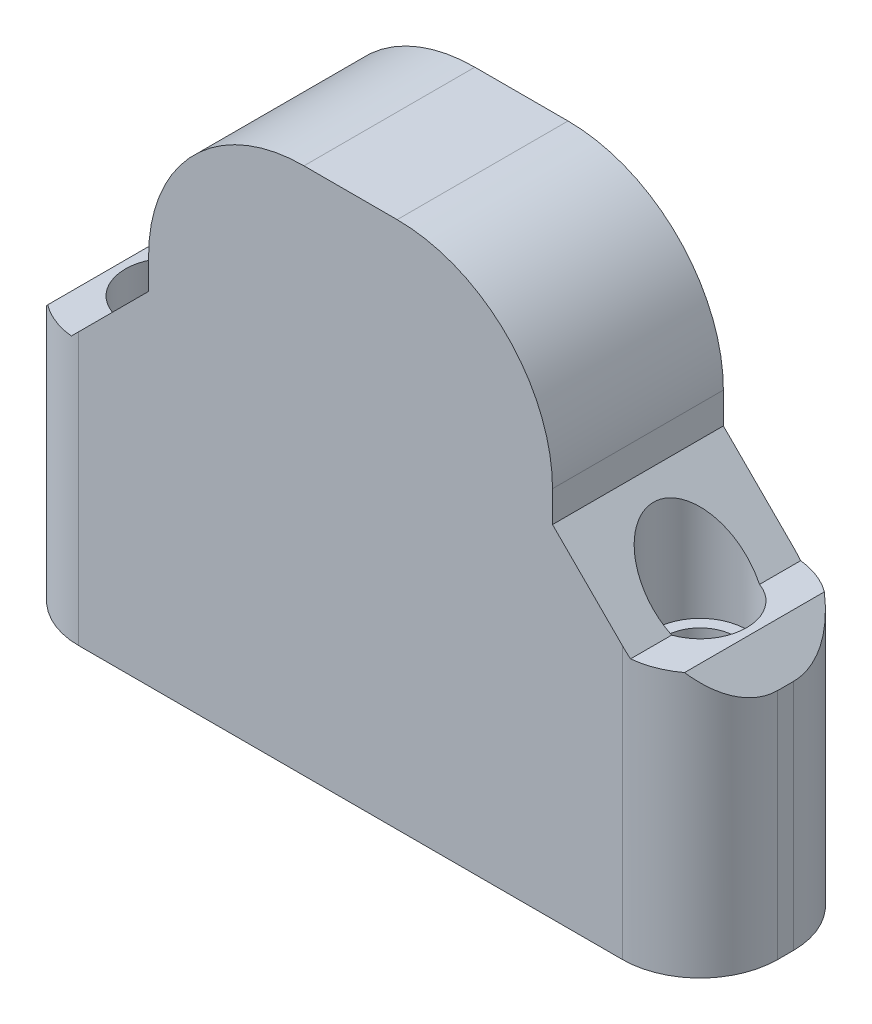
ISO-10303-21;
HEADER;
FILE_DESCRIPTION(('STEP AP214'),'2;1');
FILE_NAME('part.step','',(''),(''),'','','');
FILE_SCHEMA(('AUTOMOTIVE_DESIGN { 1 0 10303 214 1 1 1 1 }'));
ENDSEC;
DATA;
#1=APPLICATION_CONTEXT('core data for automotive mechanical design processes');
#2=APPLICATION_PROTOCOL_DEFINITION('international standard','automotive_design',2000,#1);
#3=PRODUCT_CONTEXT('',#1,'mechanical');
#4=PRODUCT('Part','Part','',(#3));
#5=PRODUCT_RELATED_PRODUCT_CATEGORY('part','',(#4));
#6=PRODUCT_DEFINITION_FORMATION('','',#4);
#7=PRODUCT_DEFINITION_CONTEXT('part definition',#1,'design');
#8=PRODUCT_DEFINITION('design','',#6,#7);
#9=PRODUCT_DEFINITION_SHAPE('','',#8);
#10=(LENGTH_UNIT() NAMED_UNIT(*) SI_UNIT(.MILLI.,.METRE.));
#11=(NAMED_UNIT(*) PLANE_ANGLE_UNIT() SI_UNIT($,.RADIAN.));
#12=(NAMED_UNIT(*) SI_UNIT($,.STERADIAN.) SOLID_ANGLE_UNIT());
#13=UNCERTAINTY_MEASURE_WITH_UNIT(LENGTH_MEASURE(1.E-05),#10,'distance_accuracy_value','');
#14=(GEOMETRIC_REPRESENTATION_CONTEXT(3) GLOBAL_UNCERTAINTY_ASSIGNED_CONTEXT((#13)) GLOBAL_UNIT_ASSIGNED_CONTEXT((#10,
#11,#12)) REPRESENTATION_CONTEXT('',''));
#15=CARTESIAN_POINT('',(0.,0.,0.));
#16=DIRECTION('',(0.,0.,1.));
#17=DIRECTION('',(1.,0.,0.));
#18=AXIS2_PLACEMENT_3D('',#15,#16,#17);
#19=CARTESIAN_POINT('',(0.,0.,0.));
#20=DIRECTION('',(0.,0.,1.));
#21=DIRECTION('',(1.,0.,0.));
#22=AXIS2_PLACEMENT_3D('',#19,#20,#21);
#23=PLANE('',#22);
#24=DIRECTION('',(-0.707106781186544,0.707106781186551,0.));
#25=VECTOR('',#24,1.);
#26=CARTESIAN_POINT('',(17.5000000000001,17.4999999999999,0.));
#27=LINE('',#26,#25);
#28=CARTESIAN_POINT('',(13.,22.0000000000001,0.));
#29=VERTEX_POINT('',#28);
#30=CARTESIAN_POINT('',(17.5,17.5,0.));
#31=VERTEX_POINT('',#30);
#32=EDGE_CURVE('E169',#29,#31,#27,.F.);
#33=ORIENTED_EDGE('',*,*,#32,.T.);
#34=DIRECTION('',(0.,1.,0.));
#35=VECTOR('',#34,1.);
#36=CARTESIAN_POINT('',(17.5,0.,0.));
#37=LINE('',#36,#35);
#38=CARTESIAN_POINT('',(17.5,0.,0.));
#39=VERTEX_POINT('',#38);
#40=EDGE_CURVE('E301',#31,#39,#37,.F.);
#41=ORIENTED_EDGE('',*,*,#40,.T.);
#42=DIRECTION('',(1.,0.,0.));
#43=VECTOR('',#42,1.);
#44=CARTESIAN_POINT('',(-22.5,0.,0.));
#45=LINE('',#44,#43);
#46=CARTESIAN_POINT('',(-17.5,0.,0.));
#47=VERTEX_POINT('',#46);
#48=EDGE_CURVE('E210',#47,#39,#45,.T.);
#49=ORIENTED_EDGE('',*,*,#48,.F.);
#50=DIRECTION('',(0.,-1.,0.));
#51=VECTOR('',#50,1.);
#52=CARTESIAN_POINT('',(-17.5,0.,0.));
#53=LINE('',#52,#51);
#54=CARTESIAN_POINT('',(-17.5,17.5000000000001,0.));
#55=VERTEX_POINT('',#54);
#56=EDGE_CURVE('E284',#47,#55,#53,.F.);
#57=ORIENTED_EDGE('',*,*,#56,.T.);
#58=DIRECTION('',(-0.707106781186551,-0.707106781186544,0.));
#59=VECTOR('',#58,1.);
#60=CARTESIAN_POINT('',(-17.4999999999999,17.5000000000001,0.));
#61=LINE('',#60,#59);
#62=CARTESIAN_POINT('',(-13.,22.,0.));
#63=VERTEX_POINT('',#62);
#64=EDGE_CURVE('E233',#55,#63,#61,.F.);
#65=ORIENTED_EDGE('',*,*,#64,.T.);
#66=DIRECTION('',(0.,-1.,0.));
#67=VECTOR('',#66,1.);
#68=CARTESIAN_POINT('',(-13.,17.,0.));
#69=LINE('',#68,#67);
#70=CARTESIAN_POINT('',(-13.,24.,0.));
#71=VERTEX_POINT('',#70);
#72=EDGE_CURVE('E201',#71,#63,#69,.T.);
#73=ORIENTED_EDGE('',*,*,#72,.F.);
#74=CARTESIAN_POINT('',(-3.,24.,0.));
#75=DIRECTION('',(0.,0.,1.));
#76=DIRECTION('',(1.,0.,0.));
#77=AXIS2_PLACEMENT_3D('',#74,#75,#76);
#78=CIRCLE('',#77,10.);
#79=CARTESIAN_POINT('',(-3.,34.,0.));
#80=VERTEX_POINT('',#79);
#81=EDGE_CURVE('E242',#71,#80,#78,.F.);
#82=ORIENTED_EDGE('',*,*,#81,.T.);
#83=DIRECTION('',(-1.,0.,0.));
#84=VECTOR('',#83,1.);
#85=CARTESIAN_POINT('',(-13.,34.,0.));
#86=LINE('',#85,#84);
#87=CARTESIAN_POINT('',(3.,34.,0.));
#88=VERTEX_POINT('',#87);
#89=EDGE_CURVE('E197',#88,#80,#86,.T.);
#90=ORIENTED_EDGE('',*,*,#89,.F.);
#91=CARTESIAN_POINT('',(3.,24.,0.));
#92=DIRECTION('',(0.,0.,1.));
#93=DIRECTION('',(1.,0.,0.));
#94=AXIS2_PLACEMENT_3D('',#91,#92,#93);
#95=CIRCLE('',#94,10.);
#96=CARTESIAN_POINT('',(13.,24.,0.));
#97=VERTEX_POINT('',#96);
#98=EDGE_CURVE('E196',#88,#97,#95,.F.);
#99=ORIENTED_EDGE('',*,*,#98,.T.);
#100=DIRECTION('',(0.,1.,0.));
#101=VECTOR('',#100,1.);
#102=CARTESIAN_POINT('',(13.,34.,0.));
#103=LINE('',#102,#101);
#104=EDGE_CURVE('E187',#29,#97,#103,.T.);
#105=ORIENTED_EDGE('',*,*,#104,.F.);
#106=EDGE_LOOP('',(#33,#41,#49,#57,#65,#73,#82,#90,#99,#105));
#107=FACE_BOUND('',#106,.T.);
#108=CARTESIAN_POINT('',(0.,22.,0.));
#109=DIRECTION('',(0.,0.,1.));
#110=DIRECTION('',(1.,0.,0.));
#111=AXIS2_PLACEMENT_3D('',#108,#109,#110);
#112=CIRCLE('',#111,8.5);
#113=CARTESIAN_POINT('',(8.5,22.,0.));
#114=VERTEX_POINT('',#113);
#115=EDGE_CURVE('E198',#114,#114,#112,.T.);
#116=ORIENTED_EDGE('',*,*,#115,.T.);
#117=EDGE_LOOP('',(#116));
#118=FACE_BOUND('',#117,.T.);
#119=ADVANCED_FACE('F32',(#107,#118),#23,.F.);
#120=CARTESIAN_POINT('',(22.5,0.,6.));
#121=DIRECTION('',(-1.,0.,0.));
#122=DIRECTION('',(0.,0.,1.));
#123=AXIS2_PLACEMENT_3D('',#120,#121,#122);
#124=PLANE('',#123);
#125=DIRECTION('',(0.,0.,-1.));
#126=VECTOR('',#125,1.);
#127=CARTESIAN_POINT('',(22.5,0.,6.));
#128=LINE('',#127,#126);
#129=CARTESIAN_POINT('',(22.5,0.,6.));
#130=VERTEX_POINT('',#129);
#131=CARTESIAN_POINT('',(22.5,0.,5.));
#132=VERTEX_POINT('',#131);
#133=EDGE_CURVE('E213',#130,#132,#128,.T.);
#134=ORIENTED_EDGE('',*,*,#133,.T.);
#135=DIRECTION('',(0.,1.,0.));
#136=VECTOR('',#135,1.);
#137=CARTESIAN_POINT('',(22.5,0.,5.));
#138=LINE('',#137,#136);
#139=CARTESIAN_POINT('',(22.5,15.,5.));
#140=VERTEX_POINT('',#139);
#141=EDGE_CURVE('E293',#132,#140,#138,.T.);
#142=ORIENTED_EDGE('',*,*,#141,.T.);
#143=DIRECTION('',(0.,0.,1.));
#144=VECTOR('',#143,1.);
#145=CARTESIAN_POINT('',(22.5,15.,6.));
#146=LINE('',#145,#144);
#147=CARTESIAN_POINT('',(22.5,15.,6.));
#148=VERTEX_POINT('',#147);
#149=EDGE_CURVE('E262',#140,#148,#146,.T.);
#150=ORIENTED_EDGE('',*,*,#149,.T.);
#151=DIRECTION('',(0.,1.,0.));
#152=VECTOR('',#151,1.);
#153=CARTESIAN_POINT('',(22.5,0.,6.));
#154=LINE('',#153,#152);
#155=EDGE_CURVE('E274',#148,#130,#154,.F.);
#156=ORIENTED_EDGE('',*,*,#155,.T.);
#157=EDGE_LOOP('',(#134,#142,#150,#156));
#158=FACE_BOUND('',#157,.T.);
#159=ADVANCED_FACE('F391',(#158),#124,.F.);
#160=CARTESIAN_POINT('',(22.5,17.,6.));
#161=DIRECTION('',(0.,-1.,0.));
#162=DIRECTION('',(1.,0.,0.));
#163=AXIS2_PLACEMENT_3D('',#160,#161,#162);
#164=PLANE('',#163);
#165=DIRECTION('',(0.,0.,-1.));
#166=VECTOR('',#165,1.);
#167=CARTESIAN_POINT('',(20.5,17.,6.));
#168=LINE('',#167,#166);
#169=CARTESIAN_POINT('',(20.5,17.,9.99999999999999));
#170=VERTEX_POINT('',#169);
#171=CARTESIAN_POINT('',(20.5,17.,1.00000000000001));
#172=VERTEX_POINT('',#171);
#173=EDGE_CURVE('E259',#170,#172,#168,.T.);
#174=ORIENTED_EDGE('',*,*,#173,.T.);
#175=CARTESIAN_POINT('',(17.5,17.,5.));
#176=DIRECTION('',(0.,-1.,0.));
#177=DIRECTION('',(1.,0.,0.));
#178=AXIS2_PLACEMENT_3D('',#175,#176,#177);
#179=CIRCLE('',#178,5.);
#180=CARTESIAN_POINT('',(18.,17.,0.0250628144669029));
#181=VERTEX_POINT('',#180);
#182=EDGE_CURVE('E298',#172,#181,#179,.F.);
#183=ORIENTED_EDGE('',*,*,#182,.T.);
#184=DIRECTION('',(0.,0.,1.));
#185=VECTOR('',#184,1.);
#186=CARTESIAN_POINT('',(18.,17.,11.));
#187=LINE('',#186,#185);
#188=CARTESIAN_POINT('',(18.,17.,2.67157287525383));
#189=VERTEX_POINT('',#188);
#190=EDGE_CURVE('E219',#181,#189,#187,.T.);
#191=ORIENTED_EDGE('',*,*,#190,.T.);
#192=CARTESIAN_POINT('',(17.,17.,5.5));
#193=DIRECTION('',(0.,1.,0.));
#194=DIRECTION('',(0.,0.,1.));
#195=AXIS2_PLACEMENT_3D('',#192,#193,#194);
#196=CIRCLE('',#195,3.);
#197=CARTESIAN_POINT('',(18.,17.,8.32842712474618));
#198=VERTEX_POINT('',#197);
#199=EDGE_CURVE('E464',#198,#189,#196,.T.);
#200=ORIENTED_EDGE('',*,*,#199,.F.);
#201=DIRECTION('',(0.,0.,1.));
#202=VECTOR('',#201,1.);
#203=CARTESIAN_POINT('',(18.,17.,11.));
#204=LINE('',#203,#202);
#205=CARTESIAN_POINT('',(18.,17.,10.9749371855331));
#206=VERTEX_POINT('',#205);
#207=EDGE_CURVE('E191',#198,#206,#204,.T.);
#208=ORIENTED_EDGE('',*,*,#207,.T.);
#209=CARTESIAN_POINT('',(17.5,17.,6.));
#210=DIRECTION('',(0.,-1.,0.));
#211=DIRECTION('',(1.,0.,0.));
#212=AXIS2_PLACEMENT_3D('',#209,#210,#211);
#213=CIRCLE('',#212,5.);
#214=EDGE_CURVE('E269',#206,#170,#213,.F.);
#215=ORIENTED_EDGE('',*,*,#214,.T.);
#216=EDGE_LOOP('',(#174,#183,#191,#200,#208,#215));
#217=FACE_BOUND('',#216,.T.);
#218=ADVANCED_FACE('F396',(#217),#164,.F.);
#219=CARTESIAN_POINT('',(13.,34.,6.));
#220=DIRECTION('',(-1.,0.,0.));
#221=DIRECTION('',(0.,-1.,0.));
#222=AXIS2_PLACEMENT_3D('',#219,#220,#221);
#223=PLANE('',#222);
#224=ORIENTED_EDGE('',*,*,#104,.T.);
#225=DIRECTION('',(0.,0.,-1.));
#226=VECTOR('',#225,1.);
#227=CARTESIAN_POINT('',(13.,24.,6.));
#228=LINE('',#227,#226);
#229=CARTESIAN_POINT('',(13.,24.,11.));
#230=VERTEX_POINT('',#229);
#231=EDGE_CURVE('E253',#97,#230,#228,.F.);
#232=ORIENTED_EDGE('',*,*,#231,.T.);
#233=DIRECTION('',(0.,1.,0.));
#234=VECTOR('',#233,1.);
#235=CARTESIAN_POINT('',(13.,17.,11.));
#236=LINE('',#235,#234);
#237=CARTESIAN_POINT('',(13.,22.0000000000001,11.));
#238=VERTEX_POINT('',#237);
#239=EDGE_CURVE('E190',#238,#230,#236,.T.);
#240=ORIENTED_EDGE('',*,*,#239,.F.);
#241=DIRECTION('',(0.,0.,-1.));
#242=VECTOR('',#241,1.);
#243=CARTESIAN_POINT('',(13.,22.0000000000001,0.));
#244=LINE('',#243,#242);
#245=EDGE_CURVE('E174',#238,#29,#244,.T.);
#246=ORIENTED_EDGE('',*,*,#245,.T.);
#247=EDGE_LOOP('',(#224,#232,#240,#246));
#248=FACE_BOUND('',#247,.T.);
#249=ADVANCED_FACE('F186',(#248),#223,.F.);
#250=CARTESIAN_POINT('',(-13.,34.,6.));
#251=DIRECTION('',(0.,-1.,0.));
#252=DIRECTION('',(0.,0.,-1.));
#253=AXIS2_PLACEMENT_3D('',#250,#251,#252);
#254=PLANE('',#253);
#255=ORIENTED_EDGE('',*,*,#89,.T.);
#256=DIRECTION('',(0.,0.,-1.));
#257=VECTOR('',#256,1.);
#258=CARTESIAN_POINT('',(-3.,34.,6.));
#259=LINE('',#258,#257);
#260=CARTESIAN_POINT('',(-3.,34.,11.));
#261=VERTEX_POINT('',#260);
#262=EDGE_CURVE('E247',#80,#261,#259,.F.);
#263=ORIENTED_EDGE('',*,*,#262,.T.);
#264=DIRECTION('',(-1.,0.,0.));
#265=VECTOR('',#264,1.);
#266=CARTESIAN_POINT('',(13.,34.,11.));
#267=LINE('',#266,#265);
#268=CARTESIAN_POINT('',(3.,34.,11.));
#269=VERTEX_POINT('',#268);
#270=EDGE_CURVE('E336',#269,#261,#267,.T.);
#271=ORIENTED_EDGE('',*,*,#270,.F.);
#272=DIRECTION('',(0.,0.,-1.));
#273=VECTOR('',#272,1.);
#274=CARTESIAN_POINT('',(3.,34.,6.));
#275=LINE('',#274,#273);
#276=EDGE_CURVE('E244',#269,#88,#275,.T.);
#277=ORIENTED_EDGE('',*,*,#276,.T.);
#278=EDGE_LOOP('',(#255,#263,#271,#277));
#279=FACE_BOUND('',#278,.T.);
#280=ADVANCED_FACE('F409',(#279),#254,.F.);
#281=CARTESIAN_POINT('',(-13.,17.,6.));
#282=DIRECTION('',(1.,0.,0.));
#283=DIRECTION('',(0.,1.,0.));
#284=AXIS2_PLACEMENT_3D('',#281,#282,#283);
#285=PLANE('',#284);
#286=DIRECTION('',(0.,-1.,0.));
#287=VECTOR('',#286,1.);
#288=CARTESIAN_POINT('',(-13.,34.,11.));
#289=LINE('',#288,#287);
#290=CARTESIAN_POINT('',(-13.,24.,11.));
#291=VERTEX_POINT('',#290);
#292=CARTESIAN_POINT('',(-13.,22.,11.));
#293=VERTEX_POINT('',#292);
#294=EDGE_CURVE('E331',#291,#293,#289,.T.);
#295=ORIENTED_EDGE('',*,*,#294,.F.);
#296=DIRECTION('',(0.,0.,-1.));
#297=VECTOR('',#296,1.);
#298=CARTESIAN_POINT('',(-13.,24.,6.));
#299=LINE('',#298,#297);
#300=EDGE_CURVE('E238',#291,#71,#299,.T.);
#301=ORIENTED_EDGE('',*,*,#300,.T.);
#302=ORIENTED_EDGE('',*,*,#72,.T.);
#303=DIRECTION('',(0.,0.,1.));
#304=VECTOR('',#303,1.);
#305=CARTESIAN_POINT('',(-13.,22.,11.));
#306=LINE('',#305,#304);
#307=EDGE_CURVE('E181',#63,#293,#306,.T.);
#308=ORIENTED_EDGE('',*,*,#307,.T.);
#309=EDGE_LOOP('',(#295,#301,#302,#308));
#310=FACE_BOUND('',#309,.T.);
#311=ADVANCED_FACE('F338',(#310),#285,.F.);
#312=CARTESIAN_POINT('',(-22.5,17.,6.));
#313=DIRECTION('',(0.,-1.,0.));
#314=DIRECTION('',(1.,0.,0.));
#315=AXIS2_PLACEMENT_3D('',#312,#313,#314);
#316=PLANE('',#315);
#317=DIRECTION('',(0.,0.,1.));
#318=VECTOR('',#317,1.);
#319=CARTESIAN_POINT('',(-20.5,17.,6.));
#320=LINE('',#319,#318);
#321=CARTESIAN_POINT('',(-20.5,17.,0.999999999999995));
#322=VERTEX_POINT('',#321);
#323=CARTESIAN_POINT('',(-20.5,17.,10.));
#324=VERTEX_POINT('',#323);
#325=EDGE_CURVE('E257',#322,#324,#320,.T.);
#326=ORIENTED_EDGE('',*,*,#325,.T.);
#327=CARTESIAN_POINT('',(-17.5,17.,6.));
#328=DIRECTION('',(0.,-1.,0.));
#329=DIRECTION('',(1.,0.,0.));
#330=AXIS2_PLACEMENT_3D('',#327,#328,#329);
#331=CIRCLE('',#330,5.);
#332=CARTESIAN_POINT('',(-18.0000000000001,17.,10.9749371855331));
#333=VERTEX_POINT('',#332);
#334=EDGE_CURVE('E40',#324,#333,#331,.F.);
#335=ORIENTED_EDGE('',*,*,#334,.T.);
#336=DIRECTION('',(0.,0.,-1.));
#337=VECTOR('',#336,1.);
#338=CARTESIAN_POINT('',(-18.0000000000001,17.,0.));
#339=LINE('',#338,#337);
#340=CARTESIAN_POINT('',(-18.0000000000001,17.,8.32842712474616));
#341=VERTEX_POINT('',#340);
#342=EDGE_CURVE('E224',#333,#341,#339,.T.);
#343=ORIENTED_EDGE('',*,*,#342,.T.);
#344=CARTESIAN_POINT('',(-17.,17.,5.5));
#345=DIRECTION('',(0.,1.,0.));
#346=DIRECTION('',(0.,0.,1.));
#347=AXIS2_PLACEMENT_3D('',#344,#345,#346);
#348=CIRCLE('',#347,3.);
#349=CARTESIAN_POINT('',(-18.0000000000001,17.,2.67157287525384));
#350=VERTEX_POINT('',#349);
#351=EDGE_CURVE('E351',#350,#341,#348,.T.);
#352=ORIENTED_EDGE('',*,*,#351,.F.);
#353=DIRECTION('',(0.,0.,-1.));
#354=VECTOR('',#353,1.);
#355=CARTESIAN_POINT('',(-18.0000000000001,17.,0.));
#356=LINE('',#355,#354);
#357=CARTESIAN_POINT('',(-18.0000000000001,17.,0.025062814466909));
#358=VERTEX_POINT('',#357);
#359=EDGE_CURVE('E221',#350,#358,#356,.T.);
#360=ORIENTED_EDGE('',*,*,#359,.T.);
#361=CARTESIAN_POINT('',(-17.5,17.,5.));
#362=DIRECTION('',(0.,-1.,0.));
#363=DIRECTION('',(1.,0.,0.));
#364=AXIS2_PLACEMENT_3D('',#361,#362,#363);
#365=CIRCLE('',#364,5.);
#366=EDGE_CURVE('E288',#358,#322,#365,.F.);
#367=ORIENTED_EDGE('',*,*,#366,.T.);
#368=EDGE_LOOP('',(#326,#335,#343,#352,#360,#367));
#369=FACE_BOUND('',#368,.T.);
#370=ADVANCED_FACE('F348',(#369),#316,.F.);
#371=CARTESIAN_POINT('',(-22.5,0.,6.));
#372=DIRECTION('',(1.,0.,0.));
#373=DIRECTION('',(0.,0.,-1.));
#374=AXIS2_PLACEMENT_3D('',#371,#372,#373);
#375=PLANE('',#374);
#376=DIRECTION('',(0.,0.,-1.));
#377=VECTOR('',#376,1.);
#378=CARTESIAN_POINT('',(-22.5,0.,6.));
#379=LINE('',#378,#377);
#380=CARTESIAN_POINT('',(-22.5,0.,6.));
#381=VERTEX_POINT('',#380);
#382=CARTESIAN_POINT('',(-22.5,0.,5.));
#383=VERTEX_POINT('',#382);
#384=EDGE_CURVE('E192',#381,#383,#379,.T.);
#385=ORIENTED_EDGE('',*,*,#384,.F.);
#386=DIRECTION('',(0.,-1.,0.));
#387=VECTOR('',#386,1.);
#388=CARTESIAN_POINT('',(-22.5,15.,6.));
#389=LINE('',#388,#387);
#390=CARTESIAN_POINT('',(-22.5,15.,6.));
#391=VERTEX_POINT('',#390);
#392=EDGE_CURVE('E310',#381,#391,#389,.F.);
#393=ORIENTED_EDGE('',*,*,#392,.T.);
#394=DIRECTION('',(0.,0.,-1.));
#395=VECTOR('',#394,1.);
#396=CARTESIAN_POINT('',(-22.5,15.,6.));
#397=LINE('',#396,#395);
#398=CARTESIAN_POINT('',(-22.5,15.,5.));
#399=VERTEX_POINT('',#398);
#400=EDGE_CURVE('E255',#391,#399,#397,.T.);
#401=ORIENTED_EDGE('',*,*,#400,.T.);
#402=DIRECTION('',(0.,-1.,0.));
#403=VECTOR('',#402,1.);
#404=CARTESIAN_POINT('',(-22.5,0.,5.));
#405=LINE('',#404,#403);
#406=EDGE_CURVE('E279',#399,#383,#405,.T.);
#407=ORIENTED_EDGE('',*,*,#406,.T.);
#408=EDGE_LOOP('',(#385,#393,#401,#407));
#409=FACE_BOUND('',#408,.T.);
#410=ADVANCED_FACE('F315',(#409),#375,.F.);
#411=CARTESIAN_POINT('',(-22.5,0.,6.));
#412=DIRECTION('',(0.,1.,0.));
#413=DIRECTION('',(0.,0.,1.));
#414=AXIS2_PLACEMENT_3D('',#411,#412,#413);
#415=PLANE('',#414);
#416=CARTESIAN_POINT('',(17.,0.,5.5));
#417=DIRECTION('',(0.,1.,0.));
#418=DIRECTION('',(0.,0.,1.));
#419=AXIS2_PLACEMENT_3D('',#416,#417,#418);
#420=CIRCLE('',#419,2.25);
#421=CARTESIAN_POINT('',(17.,0.,7.75));
#422=VERTEX_POINT('',#421);
#423=EDGE_CURVE('E355',#422,#422,#420,.T.);
#424=ORIENTED_EDGE('',*,*,#423,.T.);
#425=EDGE_LOOP('',(#424));
#426=FACE_BOUND('',#425,.T.);
#427=CARTESIAN_POINT('',(-17.,0.,5.5));
#428=DIRECTION('',(0.,1.,0.));
#429=DIRECTION('',(0.,0.,1.));
#430=AXIS2_PLACEMENT_3D('',#427,#428,#429);
#431=CIRCLE('',#430,2.25);
#432=CARTESIAN_POINT('',(-17.,0.,7.75));
#433=VERTEX_POINT('',#432);
#434=EDGE_CURVE('E367',#433,#433,#431,.T.);
#435=ORIENTED_EDGE('',*,*,#434,.T.);
#436=EDGE_LOOP('',(#435));
#437=FACE_BOUND('',#436,.T.);
#438=DIRECTION('',(1.,0.,0.));
#439=VECTOR('',#438,1.);
#440=CARTESIAN_POINT('',(-22.5,0.,11.));
#441=LINE('',#440,#439);
#442=CARTESIAN_POINT('',(-17.5,0.,11.));
#443=VERTEX_POINT('',#442);
#444=CARTESIAN_POINT('',(17.5,0.,11.));
#445=VERTEX_POINT('',#444);
#446=EDGE_CURVE('E370',#443,#445,#441,.T.);
#447=ORIENTED_EDGE('',*,*,#446,.F.);
#448=CARTESIAN_POINT('',(-17.5,0.,6.));
#449=DIRECTION('',(0.,1.,0.));
#450=DIRECTION('',(0.,0.,1.));
#451=AXIS2_PLACEMENT_3D('',#448,#449,#450);
#452=CIRCLE('',#451,5.);
#453=EDGE_CURVE('E308',#443,#381,#452,.F.);
#454=ORIENTED_EDGE('',*,*,#453,.T.);
#455=ORIENTED_EDGE('',*,*,#384,.T.);
#456=CARTESIAN_POINT('',(-17.5,0.,5.));
#457=DIRECTION('',(0.,1.,0.));
#458=DIRECTION('',(0.,0.,1.));
#459=AXIS2_PLACEMENT_3D('',#456,#457,#458);
#460=CIRCLE('',#459,5.);
#461=EDGE_CURVE('E282',#383,#47,#460,.F.);
#462=ORIENTED_EDGE('',*,*,#461,.T.);
#463=ORIENTED_EDGE('',*,*,#48,.T.);
#464=CARTESIAN_POINT('',(17.5,0.,5.));
#465=DIRECTION('',(0.,1.,0.));
#466=DIRECTION('',(0.,0.,1.));
#467=AXIS2_PLACEMENT_3D('',#464,#465,#466);
#468=CIRCLE('',#467,5.);
#469=EDGE_CURVE('E303',#39,#132,#468,.F.);
#470=ORIENTED_EDGE('',*,*,#469,.T.);
#471=ORIENTED_EDGE('',*,*,#133,.F.);
#472=CARTESIAN_POINT('',(17.5,0.,6.));
#473=DIRECTION('',(0.,1.,0.));
#474=DIRECTION('',(0.,0.,1.));
#475=AXIS2_PLACEMENT_3D('',#472,#473,#474);
#476=CIRCLE('',#475,5.);
#477=EDGE_CURVE('E276',#130,#445,#476,.F.);
#478=ORIENTED_EDGE('',*,*,#477,.T.);
#479=EDGE_LOOP('',(#447,#454,#455,#462,#463,#470,#471,#478));
#480=FACE_BOUND('',#479,.T.);
#481=ADVANCED_FACE('F388',(#426,#437,#480),#415,.F.);
#482=CARTESIAN_POINT('',(0.,22.,6.));
#483=DIRECTION('',(0.,0.,-1.));
#484=DIRECTION('',(-1.,0.,0.));
#485=AXIS2_PLACEMENT_3D('',#482,#483,#484);
#486=CYLINDRICAL_SURFACE('',#485,8.5);
#487=CARTESIAN_POINT('',(0.,22.,6.));
#488=DIRECTION('',(0.,0.,1.));
#489=DIRECTION('',(1.,0.,0.));
#490=AXIS2_PLACEMENT_3D('',#487,#488,#489);
#491=CIRCLE('',#490,8.5);
#492=CARTESIAN_POINT('',(8.5,22.,6.));
#493=VERTEX_POINT('',#492);
#494=EDGE_CURVE('E204',#493,#493,#491,.T.);
#495=ORIENTED_EDGE('',*,*,#494,.T.);
#496=EDGE_LOOP('',(#495));
#497=FACE_BOUND('',#496,.T.);
#498=ORIENTED_EDGE('',*,*,#115,.F.);
#499=EDGE_LOOP('',(#498));
#500=FACE_BOUND('',#499,.T.);
#501=ADVANCED_FACE('F376',(#497,#500),#486,.F.);
#502=CARTESIAN_POINT('',(0.,0.,6.));
#503=DIRECTION('',(0.,0.,1.));
#504=DIRECTION('',(1.,0.,0.));
#505=AXIS2_PLACEMENT_3D('',#502,#503,#504);
#506=PLANE('',#505);
#507=ORIENTED_EDGE('',*,*,#494,.F.);
#508=EDGE_LOOP('',(#507));
#509=FACE_BOUND('',#508,.T.);
#510=ADVANCED_FACE('F379',(#509),#506,.F.);
#511=CARTESIAN_POINT('',(0.,0.,11.));
#512=DIRECTION('',(0.,0.,1.));
#513=DIRECTION('',(1.,0.,0.));
#514=AXIS2_PLACEMENT_3D('',#511,#512,#513);
#515=PLANE('',#514);
#516=DIRECTION('',(0.707106781186551,0.707106781186544,0.));
#517=VECTOR('',#516,1.);
#518=CARTESIAN_POINT('',(-18.0000000000001,17.,11.));
#519=LINE('',#518,#517);
#520=CARTESIAN_POINT('',(-17.5,17.5000000000001,11.));
#521=VERTEX_POINT('',#520);
#522=EDGE_CURVE('E235',#293,#521,#519,.F.);
#523=ORIENTED_EDGE('',*,*,#522,.T.);
#524=DIRECTION('',(0.,-1.,0.));
#525=VECTOR('',#524,1.);
#526=CARTESIAN_POINT('',(-17.5,0.,11.));
#527=LINE('',#526,#525);
#528=EDGE_CURVE('E305',#521,#443,#527,.T.);
#529=ORIENTED_EDGE('',*,*,#528,.T.);
#530=ORIENTED_EDGE('',*,*,#446,.T.);
#531=DIRECTION('',(0.,1.,0.));
#532=VECTOR('',#531,1.);
#533=CARTESIAN_POINT('',(17.5,15.,11.));
#534=LINE('',#533,#532);
#535=CARTESIAN_POINT('',(17.5,17.5,11.));
#536=VERTEX_POINT('',#535);
#537=EDGE_CURVE('E264',#445,#536,#534,.T.);
#538=ORIENTED_EDGE('',*,*,#537,.T.);
#539=DIRECTION('',(0.707106781186544,-0.707106781186551,0.));
#540=VECTOR('',#539,1.);
#541=CARTESIAN_POINT('',(13.,22.0000000000001,11.));
#542=LINE('',#541,#540);
#543=EDGE_CURVE('E229',#536,#238,#542,.F.);
#544=ORIENTED_EDGE('',*,*,#543,.T.);
#545=ORIENTED_EDGE('',*,*,#239,.T.);
#546=CARTESIAN_POINT('',(3.,24.,11.));
#547=DIRECTION('',(0.,0.,1.));
#548=DIRECTION('',(1.,0.,0.));
#549=AXIS2_PLACEMENT_3D('',#546,#547,#548);
#550=CIRCLE('',#549,10.);
#551=EDGE_CURVE('E249',#230,#269,#550,.T.);
#552=ORIENTED_EDGE('',*,*,#551,.T.);
#553=ORIENTED_EDGE('',*,*,#270,.T.);
#554=CARTESIAN_POINT('',(-3.,24.,11.));
#555=DIRECTION('',(0.,0.,1.));
#556=DIRECTION('',(1.,0.,0.));
#557=AXIS2_PLACEMENT_3D('',#554,#555,#556);
#558=CIRCLE('',#557,10.);
#559=EDGE_CURVE('E251',#261,#291,#558,.T.);
#560=ORIENTED_EDGE('',*,*,#559,.T.);
#561=ORIENTED_EDGE('',*,*,#294,.T.);
#562=EDGE_LOOP('',(#523,#529,#530,#538,#544,#545,#552,#553,#560,#561));
#563=FACE_BOUND('',#562,.T.);
#564=ADVANCED_FACE('F328',(#563),#515,.T.);
#565=CARTESIAN_POINT('',(-17.,17.,5.5));
#566=DIRECTION('',(0.,1.,0.));
#567=DIRECTION('',(0.,0.,1.));
#568=AXIS2_PLACEMENT_3D('',#565,#566,#567);
#569=CYLINDRICAL_SURFACE('',#568,2.25);
#570=ORIENTED_EDGE('',*,*,#434,.F.);
#571=EDGE_LOOP('',(#570));
#572=FACE_BOUND('',#571,.T.);
#573=CARTESIAN_POINT('',(-17.,13.9,5.5));
#574=DIRECTION('',(0.,1.,0.));
#575=DIRECTION('',(0.,0.,1.));
#576=AXIS2_PLACEMENT_3D('',#573,#574,#575);
#577=CIRCLE('',#576,2.25);
#578=CARTESIAN_POINT('',(-17.,13.9,7.75));
#579=VERTEX_POINT('',#578);
#580=EDGE_CURVE('E358',#579,#579,#577,.T.);
#581=ORIENTED_EDGE('',*,*,#580,.T.);
#582=EDGE_LOOP('',(#581));
#583=FACE_BOUND('',#582,.T.);
#584=ADVANCED_FACE('F386',(#572,#583),#569,.F.);
#585=CARTESIAN_POINT('',(-14.75,13.9,5.5));
#586=DIRECTION('',(0.,-1.,0.));
#587=DIRECTION('',(0.,0.,-1.));
#588=AXIS2_PLACEMENT_3D('',#585,#586,#587);
#589=PLANE('',#588);
#590=ORIENTED_EDGE('',*,*,#580,.F.);
#591=EDGE_LOOP('',(#590));
#592=FACE_BOUND('',#591,.T.);
#593=CARTESIAN_POINT('',(-17.,13.9,5.5));
#594=DIRECTION('',(0.,1.,0.));
#595=DIRECTION('',(0.,0.,1.));
#596=AXIS2_PLACEMENT_3D('',#593,#594,#595);
#597=CIRCLE('',#596,3.);
#598=CARTESIAN_POINT('',(-17.,13.9,8.5));
#599=VERTEX_POINT('',#598);
#600=EDGE_CURVE('E354',#599,#599,#597,.T.);
#601=ORIENTED_EDGE('',*,*,#600,.T.);
#602=EDGE_LOOP('',(#601));
#603=FACE_BOUND('',#602,.T.);
#604=ADVANCED_FACE('F491',(#592,#603),#589,.F.);
#605=CARTESIAN_POINT('',(-17.,17.,5.5));
#606=DIRECTION('',(0.,1.,0.));
#607=DIRECTION('',(0.,0.,1.));
#608=AXIS2_PLACEMENT_3D('',#605,#606,#607);
#609=CYLINDRICAL_SURFACE('',#608,3.);
#610=ORIENTED_EDGE('',*,*,#600,.F.);
#611=EDGE_LOOP('',(#610));
#612=FACE_BOUND('',#611,.T.);
#613=ORIENTED_EDGE('',*,*,#351,.T.);
#614=CARTESIAN_POINT('',(-17.,18.0000000000001,5.5));
#615=DIRECTION('',(-0.707106781186544,0.707106781186551,0.));
#616=DIRECTION('',(0.707106781186551,0.707106781186544,0.));
#617=AXIS2_PLACEMENT_3D('',#614,#615,#616);
#618=ELLIPSE('',#617,4.24264068711926,3.);
#619=EDGE_CURVE('E231',#341,#350,#618,.T.);
#620=ORIENTED_EDGE('',*,*,#619,.T.);
#621=EDGE_LOOP('',(#613,#620));
#622=FACE_BOUND('',#621,.T.);
#623=ADVANCED_FACE('F353',(#612,#622),#609,.F.);
#624=CARTESIAN_POINT('',(17.,17.,5.5));
#625=DIRECTION('',(0.,1.,0.));
#626=DIRECTION('',(0.,0.,1.));
#627=AXIS2_PLACEMENT_3D('',#624,#625,#626);
#628=CYLINDRICAL_SURFACE('',#627,2.25);
#629=ORIENTED_EDGE('',*,*,#423,.F.);
#630=EDGE_LOOP('',(#629));
#631=FACE_BOUND('',#630,.T.);
#632=CARTESIAN_POINT('',(17.,13.9,5.5));
#633=DIRECTION('',(0.,1.,0.));
#634=DIRECTION('',(0.,0.,1.));
#635=AXIS2_PLACEMENT_3D('',#632,#633,#634);
#636=CIRCLE('',#635,2.25);
#637=CARTESIAN_POINT('',(17.,13.9,7.75));
#638=VERTEX_POINT('',#637);
#639=EDGE_CURVE('E361',#638,#638,#636,.T.);
#640=ORIENTED_EDGE('',*,*,#639,.T.);
#641=EDGE_LOOP('',(#640));
#642=FACE_BOUND('',#641,.T.);
#643=ADVANCED_FACE('F473',(#631,#642),#628,.F.);
#644=CARTESIAN_POINT('',(19.25,13.9,5.5));
#645=DIRECTION('',(0.,-1.,0.));
#646=DIRECTION('',(0.,0.,-1.));
#647=AXIS2_PLACEMENT_3D('',#644,#645,#646);
#648=PLANE('',#647);
#649=ORIENTED_EDGE('',*,*,#639,.F.);
#650=EDGE_LOOP('',(#649));
#651=FACE_BOUND('',#650,.T.);
#652=CARTESIAN_POINT('',(17.,13.9,5.5));
#653=DIRECTION('',(0.,1.,0.));
#654=DIRECTION('',(0.,0.,1.));
#655=AXIS2_PLACEMENT_3D('',#652,#653,#654);
#656=CIRCLE('',#655,3.);
#657=CARTESIAN_POINT('',(17.,13.9,8.5));
#658=VERTEX_POINT('',#657);
#659=EDGE_CURVE('E466',#658,#658,#656,.T.);
#660=ORIENTED_EDGE('',*,*,#659,.T.);
#661=EDGE_LOOP('',(#660));
#662=FACE_BOUND('',#661,.T.);
#663=ADVANCED_FACE('F475',(#651,#662),#648,.F.);
#664=CARTESIAN_POINT('',(17.,17.,5.5));
#665=DIRECTION('',(0.,1.,0.));
#666=DIRECTION('',(0.,0.,1.));
#667=AXIS2_PLACEMENT_3D('',#664,#665,#666);
#668=CYLINDRICAL_SURFACE('',#667,3.);
#669=ORIENTED_EDGE('',*,*,#659,.F.);
#670=EDGE_LOOP('',(#669));
#671=FACE_BOUND('',#670,.T.);
#672=ORIENTED_EDGE('',*,*,#199,.T.);
#673=CARTESIAN_POINT('',(17.,18.,5.5));
#674=DIRECTION('',(0.707106781186551,0.707106781186544,0.));
#675=DIRECTION('',(-0.707106781186544,0.707106781186551,0.));
#676=AXIS2_PLACEMENT_3D('',#673,#674,#675);
#677=ELLIPSE('',#676,4.2426406871193,3.);
#678=EDGE_CURVE('E180',#189,#198,#677,.T.);
#679=ORIENTED_EDGE('',*,*,#678,.T.);
#680=EDGE_LOOP('',(#672,#679));
#681=FACE_BOUND('',#680,.T.);
#682=ADVANCED_FACE('F420',(#671,#681),#668,.F.);
#683=CARTESIAN_POINT('',(13.,22.0000000000001,6.));
#684=DIRECTION('',(0.707106781186551,0.707106781186544,0.));
#685=DIRECTION('',(0.,0.,1.));
#686=AXIS2_PLACEMENT_3D('',#683,#684,#685);
#687=PLANE('',#686);
#688=ORIENTED_EDGE('',*,*,#190,.F.);
#689=CARTESIAN_POINT('',(17.5,17.5,5.));
#690=DIRECTION('',(0.707106781186551,0.707106781186544,0.));
#691=DIRECTION('',(-0.707106781186544,0.707106781186551,0.));
#692=AXIS2_PLACEMENT_3D('',#689,#690,#691);
#693=ELLIPSE('',#692,7.07106781186551,5.);
#694=EDGE_CURVE('E176',#181,#31,#693,.T.);
#695=ORIENTED_EDGE('',*,*,#694,.T.);
#696=ORIENTED_EDGE('',*,*,#32,.F.);
#697=ORIENTED_EDGE('',*,*,#245,.F.);
#698=ORIENTED_EDGE('',*,*,#543,.F.);
#699=CARTESIAN_POINT('',(17.5,17.5,6.));
#700=DIRECTION('',(0.707106781186551,0.707106781186544,0.));
#701=DIRECTION('',(0.707106781186544,-0.707106781186551,0.));
#702=AXIS2_PLACEMENT_3D('',#699,#700,#701);
#703=ELLIPSE('',#702,7.07106781186551,5.);
#704=EDGE_CURVE('E267',#536,#206,#703,.T.);
#705=ORIENTED_EDGE('',*,*,#704,.T.);
#706=ORIENTED_EDGE('',*,*,#207,.F.);
#707=ORIENTED_EDGE('',*,*,#678,.F.);
#708=EDGE_LOOP('',(#688,#695,#696,#697,#698,#705,#706,#707));
#709=FACE_BOUND('',#708,.T.);
#710=ADVANCED_FACE('F172',(#709),#687,.T.);
#711=CARTESIAN_POINT('',(-18.0000000000001,17.,6.));
#712=DIRECTION('',(-0.707106781186544,0.707106781186551,0.));
#713=DIRECTION('',(0.,0.,1.));
#714=AXIS2_PLACEMENT_3D('',#711,#712,#713);
#715=PLANE('',#714);
#716=ORIENTED_EDGE('',*,*,#342,.F.);
#717=CARTESIAN_POINT('',(-17.5,17.5000000000001,6.));
#718=DIRECTION('',(-0.707106781186544,0.707106781186551,0.));
#719=DIRECTION('',(0.707106781186551,0.707106781186544,0.));
#720=AXIS2_PLACEMENT_3D('',#717,#718,#719);
#721=ELLIPSE('',#720,7.07106781186544,5.);
#722=EDGE_CURVE('E11',#333,#521,#721,.T.);
#723=ORIENTED_EDGE('',*,*,#722,.T.);
#724=ORIENTED_EDGE('',*,*,#522,.F.);
#725=ORIENTED_EDGE('',*,*,#307,.F.);
#726=ORIENTED_EDGE('',*,*,#64,.F.);
#727=CARTESIAN_POINT('',(-17.5,17.5000000000001,5.));
#728=DIRECTION('',(-0.707106781186544,0.707106781186551,0.));
#729=DIRECTION('',(-0.707106781186551,-0.707106781186544,0.));
#730=AXIS2_PLACEMENT_3D('',#727,#728,#729);
#731=ELLIPSE('',#730,7.07106781186544,5.);
#732=EDGE_CURVE('E286',#55,#358,#731,.T.);
#733=ORIENTED_EDGE('',*,*,#732,.T.);
#734=ORIENTED_EDGE('',*,*,#359,.F.);
#735=ORIENTED_EDGE('',*,*,#619,.F.);
#736=EDGE_LOOP('',(#716,#723,#724,#725,#726,#733,#734,#735));
#737=FACE_BOUND('',#736,.T.);
#738=ADVANCED_FACE('F324',(#737),#715,.T.);
#739=CARTESIAN_POINT('',(-3.,24.,6.));
#740=DIRECTION('',(0.,0.,-1.));
#741=DIRECTION('',(-1.,0.,0.));
#742=AXIS2_PLACEMENT_3D('',#739,#740,#741);
#743=CYLINDRICAL_SURFACE('',#742,10.);
#744=ORIENTED_EDGE('',*,*,#559,.F.);
#745=ORIENTED_EDGE('',*,*,#262,.F.);
#746=ORIENTED_EDGE('',*,*,#81,.F.);
#747=ORIENTED_EDGE('',*,*,#300,.F.);
#748=EDGE_LOOP('',(#744,#745,#746,#747));
#749=FACE_BOUND('',#748,.T.);
#750=ADVANCED_FACE('F423',(#749),#743,.T.);
#751=CARTESIAN_POINT('',(3.,24.,6.));
#752=DIRECTION('',(0.,0.,-1.));
#753=DIRECTION('',(-1.,0.,0.));
#754=AXIS2_PLACEMENT_3D('',#751,#752,#753);
#755=CYLINDRICAL_SURFACE('',#754,10.);
#756=ORIENTED_EDGE('',*,*,#551,.F.);
#757=ORIENTED_EDGE('',*,*,#231,.F.);
#758=ORIENTED_EDGE('',*,*,#98,.F.);
#759=ORIENTED_EDGE('',*,*,#276,.F.);
#760=EDGE_LOOP('',(#756,#757,#758,#759));
#761=FACE_BOUND('',#760,.T.);
#762=ADVANCED_FACE('F426',(#761),#755,.T.);
#763=CARTESIAN_POINT('',(-22.5,15.,6.));
#764=DIRECTION('',(0.707106781186548,-0.707106781186547,0.));
#765=DIRECTION('',(0.,0.,-1.));
#766=AXIS2_PLACEMENT_3D('',#763,#764,#765);
#767=PLANE('',#766);
#768=ORIENTED_EDGE('',*,*,#400,.F.);
#769=CARTESIAN_POINT('',(-17.5,20.,6.));
#770=DIRECTION('',(0.707106781186548,-0.707106781186547,0.));
#771=DIRECTION('',(0.707106781186547,0.707106781186548,0.));
#772=AXIS2_PLACEMENT_3D('',#769,#770,#771);
#773=ELLIPSE('',#772,7.07106781186548,5.);
#774=EDGE_CURVE('E54',#391,#324,#773,.F.);
#775=ORIENTED_EDGE('',*,*,#774,.T.);
#776=ORIENTED_EDGE('',*,*,#325,.F.);
#777=CARTESIAN_POINT('',(-17.5,20.,5.));
#778=DIRECTION('',(0.707106781186548,-0.707106781186547,0.));
#779=DIRECTION('',(-0.707106781186547,-0.707106781186548,0.));
#780=AXIS2_PLACEMENT_3D('',#777,#778,#779);
#781=ELLIPSE('',#780,7.07106781186548,5.);
#782=EDGE_CURVE('E290',#322,#399,#781,.F.);
#783=ORIENTED_EDGE('',*,*,#782,.T.);
#784=EDGE_LOOP('',(#768,#775,#776,#783));
#785=FACE_BOUND('',#784,.T.);
#786=ADVANCED_FACE('F317',(#785),#767,.F.);
#787=CARTESIAN_POINT('',(20.5,17.,6.));
#788=DIRECTION('',(-0.707106781186549,-0.707106781186546,0.));
#789=DIRECTION('',(0.,0.,-1.));
#790=AXIS2_PLACEMENT_3D('',#787,#788,#789);
#791=PLANE('',#790);
#792=ORIENTED_EDGE('',*,*,#149,.F.);
#793=CARTESIAN_POINT('',(17.5,20.,5.));
#794=DIRECTION('',(-0.707106781186549,-0.707106781186546,0.));
#795=DIRECTION('',(-0.707106781186546,0.707106781186549,0.));
#796=AXIS2_PLACEMENT_3D('',#793,#794,#795);
#797=ELLIPSE('',#796,7.07106781186549,5.);
#798=EDGE_CURVE('E296',#140,#172,#797,.F.);
#799=ORIENTED_EDGE('',*,*,#798,.T.);
#800=ORIENTED_EDGE('',*,*,#173,.F.);
#801=CARTESIAN_POINT('',(17.5,20.,6.));
#802=DIRECTION('',(-0.707106781186549,-0.707106781186546,0.));
#803=DIRECTION('',(0.707106781186546,-0.707106781186549,0.));
#804=AXIS2_PLACEMENT_3D('',#801,#802,#803);
#805=ELLIPSE('',#804,7.07106781186549,5.);
#806=EDGE_CURVE('E271',#170,#148,#805,.F.);
#807=ORIENTED_EDGE('',*,*,#806,.T.);
#808=EDGE_LOOP('',(#792,#799,#800,#807));
#809=FACE_BOUND('',#808,.T.);
#810=ADVANCED_FACE('F433',(#809),#791,.F.);
#811=CARTESIAN_POINT('',(17.5,0.,6.));
#812=DIRECTION('',(0.,-1.,0.));
#813=DIRECTION('',(0.,0.,-1.));
#814=AXIS2_PLACEMENT_3D('',#811,#812,#813);
#815=CYLINDRICAL_SURFACE('',#814,5.);
#816=ORIENTED_EDGE('',*,*,#477,.F.);
#817=ORIENTED_EDGE('',*,*,#155,.F.);
#818=ORIENTED_EDGE('',*,*,#806,.F.);
#819=ORIENTED_EDGE('',*,*,#214,.F.);
#820=ORIENTED_EDGE('',*,*,#704,.F.);
#821=ORIENTED_EDGE('',*,*,#537,.F.);
#822=EDGE_LOOP('',(#816,#817,#818,#819,#820,#821));
#823=FACE_BOUND('',#822,.T.);
#824=ADVANCED_FACE('F436',(#823),#815,.T.);
#825=CARTESIAN_POINT('',(-17.5,0.,5.));
#826=DIRECTION('',(0.,-1.,0.));
#827=DIRECTION('',(0.,0.,-1.));
#828=AXIS2_PLACEMENT_3D('',#825,#826,#827);
#829=CYLINDRICAL_SURFACE('',#828,5.);
#830=ORIENTED_EDGE('',*,*,#732,.F.);
#831=ORIENTED_EDGE('',*,*,#56,.F.);
#832=ORIENTED_EDGE('',*,*,#461,.F.);
#833=ORIENTED_EDGE('',*,*,#406,.F.);
#834=ORIENTED_EDGE('',*,*,#782,.F.);
#835=ORIENTED_EDGE('',*,*,#366,.F.);
#836=EDGE_LOOP('',(#830,#831,#832,#833,#834,#835));
#837=FACE_BOUND('',#836,.T.);
#838=ADVANCED_FACE('F346',(#837),#829,.T.);
#839=CARTESIAN_POINT('',(17.5,0.,5.));
#840=DIRECTION('',(0.,1.,0.));
#841=DIRECTION('',(0.,0.,1.));
#842=AXIS2_PLACEMENT_3D('',#839,#840,#841);
#843=CYLINDRICAL_SURFACE('',#842,5.);
#844=ORIENTED_EDGE('',*,*,#469,.F.);
#845=ORIENTED_EDGE('',*,*,#40,.F.);
#846=ORIENTED_EDGE('',*,*,#694,.F.);
#847=ORIENTED_EDGE('',*,*,#182,.F.);
#848=ORIENTED_EDGE('',*,*,#798,.F.);
#849=ORIENTED_EDGE('',*,*,#141,.F.);
#850=EDGE_LOOP('',(#844,#845,#846,#847,#848,#849));
#851=FACE_BOUND('',#850,.T.);
#852=ADVANCED_FACE('F442',(#851),#843,.T.);
#853=CARTESIAN_POINT('',(-17.5,0.,6.));
#854=DIRECTION('',(0.,1.,0.));
#855=DIRECTION('',(0.,0.,1.));
#856=AXIS2_PLACEMENT_3D('',#853,#854,#855);
#857=CYLINDRICAL_SURFACE('',#856,5.);
#858=ORIENTED_EDGE('',*,*,#774,.F.);
#859=ORIENTED_EDGE('',*,*,#392,.F.);
#860=ORIENTED_EDGE('',*,*,#453,.F.);
#861=ORIENTED_EDGE('',*,*,#528,.F.);
#862=ORIENTED_EDGE('',*,*,#722,.F.);
#863=ORIENTED_EDGE('',*,*,#334,.F.);
#864=EDGE_LOOP('',(#858,#859,#860,#861,#862,#863));
#865=FACE_BOUND('',#864,.T.);
#866=ADVANCED_FACE('F34',(#865),#857,.T.);
#867=CLOSED_SHELL('',(#119,#159,#218,#249,#280,#311,#370,#410,#481,#501,#510,#564,#584,#604,
#623,#643,#663,#682,#710,#738,#750,#762,#786,#810,#824,#838,#852,#866));
#868=MANIFOLD_SOLID_BREP('B2',#867);
#869=ADVANCED_BREP_SHAPE_REPRESENTATION('',(#18,#868),#14);
#870=SHAPE_DEFINITION_REPRESENTATION(#9,#869);
ENDSEC;
END-ISO-10303-21;
